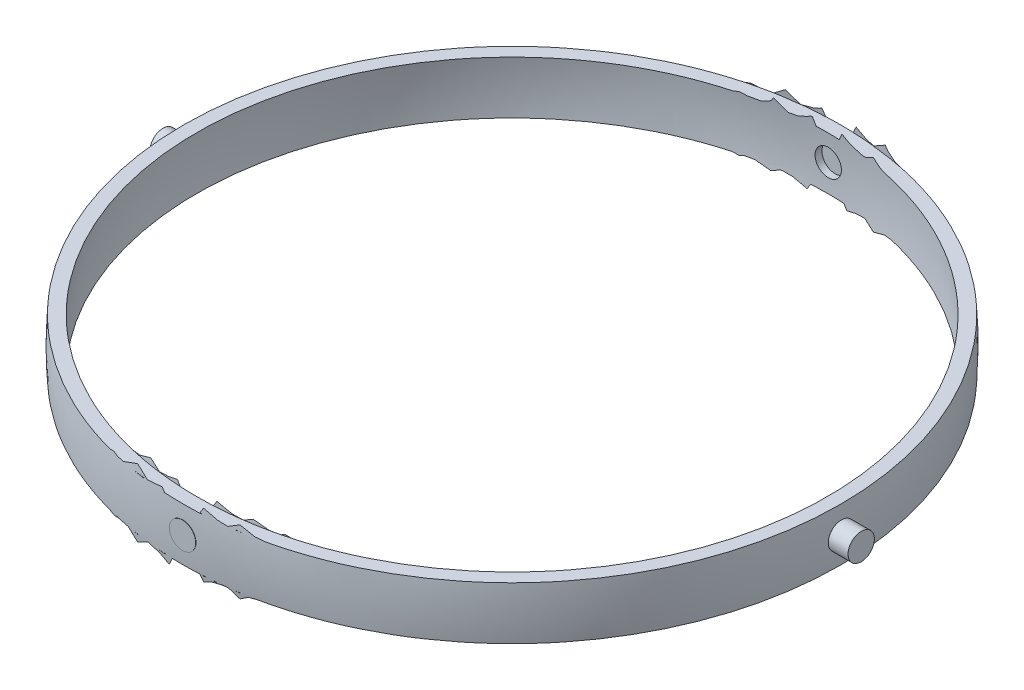
ISO-10303-21;
HEADER;
FILE_DESCRIPTION(('STEP AP214'),'2;1');
FILE_NAME('part.step','',(''),(''),'','','');
FILE_SCHEMA(('AUTOMOTIVE_DESIGN { 1 0 10303 214 1 1 1 1 }'));
ENDSEC;
DATA;
#1=APPLICATION_CONTEXT('core data for automotive mechanical design processes');
#2=APPLICATION_PROTOCOL_DEFINITION('international standard','automotive_design',2000,#1);
#3=PRODUCT_CONTEXT('',#1,'mechanical');
#4=PRODUCT('Part','Part','',(#3));
#5=PRODUCT_RELATED_PRODUCT_CATEGORY('part','',(#4));
#6=PRODUCT_DEFINITION_FORMATION('','',#4);
#7=PRODUCT_DEFINITION_CONTEXT('part definition',#1,'design');
#8=PRODUCT_DEFINITION('design','',#6,#7);
#9=PRODUCT_DEFINITION_SHAPE('','',#8);
#10=(LENGTH_UNIT() NAMED_UNIT(*) SI_UNIT(.MILLI.,.METRE.));
#11=(NAMED_UNIT(*) PLANE_ANGLE_UNIT() SI_UNIT($,.RADIAN.));
#12=(NAMED_UNIT(*) SI_UNIT($,.STERADIAN.) SOLID_ANGLE_UNIT());
#13=UNCERTAINTY_MEASURE_WITH_UNIT(LENGTH_MEASURE(1.E-05),#10,'distance_accuracy_value','');
#14=(GEOMETRIC_REPRESENTATION_CONTEXT(3) GLOBAL_UNCERTAINTY_ASSIGNED_CONTEXT((#13)) GLOBAL_UNIT_ASSIGNED_CONTEXT((#10,
#11,#12)) REPRESENTATION_CONTEXT('',''));
#15=CARTESIAN_POINT('',(0.,0.,0.));
#16=DIRECTION('',(0.,0.,1.));
#17=DIRECTION('',(1.,0.,0.));
#18=AXIS2_PLACEMENT_3D('',#15,#16,#17);
#19=CARTESIAN_POINT('',(-52.9600007301569,0.,0.));
#20=DIRECTION('',(1.,0.,0.));
#21=DIRECTION('',(0.,1.,0.));
#22=AXIS2_PLACEMENT_3D('',#19,#20,#21);
#23=PLANE('',#22);
#24=CARTESIAN_POINT('',(-52.9600007301569,0.,0.));
#25=DIRECTION('',(-1.,0.,0.));
#26=DIRECTION('',(0.,1.,0.));
#27=AXIS2_PLACEMENT_3D('',#24,#25,#26);
#28=CIRCLE('',#27,2.);
#29=CARTESIAN_POINT('',(-52.9600007301569,-2.,0.));
#30=VERTEX_POINT('',#29);
#31=EDGE_CURVE('E9',#30,#30,#28,.T.);
#32=ORIENTED_EDGE('',*,*,#31,.T.);
#33=EDGE_LOOP('',(#32));
#34=FACE_BOUND('',#33,.T.);
#35=ADVANCED_FACE('F14',(#34),#23,.F.);
#36=CARTESIAN_POINT('',(52.9600007301569,0.,0.));
#37=DIRECTION('',(1.,0.,0.));
#38=DIRECTION('',(0.,1.,0.));
#39=AXIS2_PLACEMENT_3D('',#36,#37,#38);
#40=PLANE('',#39);
#41=CARTESIAN_POINT('',(52.9600007301569,0.,0.));
#42=DIRECTION('',(1.,0.,0.));
#43=DIRECTION('',(0.,1.,0.));
#44=AXIS2_PLACEMENT_3D('',#41,#42,#43);
#45=CIRCLE('',#44,2.);
#46=CARTESIAN_POINT('',(52.9600007301569,-2.,0.));
#47=VERTEX_POINT('',#46);
#48=EDGE_CURVE('E25',#47,#47,#45,.T.);
#49=ORIENTED_EDGE('',*,*,#48,.T.);
#50=EDGE_LOOP('',(#49));
#51=FACE_BOUND('',#50,.T.);
#52=ADVANCED_FACE('F214',(#51),#40,.T.);
#53=CARTESIAN_POINT('',(0.,0.,-50.));
#54=DIRECTION('',(0.,0.,1.));
#55=DIRECTION('',(1.,0.,0.));
#56=AXIS2_PLACEMENT_3D('',#53,#54,#55);
#57=CYLINDRICAL_SURFACE('',#56,2.);
#58=CARTESIAN_POINT('',(0.,0.,-49.9599839871872));
#59=DIRECTION('',(0.,0.,1.));
#60=DIRECTION('',(1.,0.,0.));
#61=AXIS2_PLACEMENT_3D('',#58,#59,#60);
#62=CIRCLE('',#61,2.);
#63=CARTESIAN_POINT('',(-2.,0.,-49.9599839871872));
#64=VERTEX_POINT('',#63);
#65=EDGE_CURVE('E104',#64,#64,#62,.T.);
#66=ORIENTED_EDGE('',*,*,#65,.F.);
#67=DIRECTION('',(0.,0.,-1.));
#68=VECTOR('',#67,1.);
#69=CARTESIAN_POINT('',(-2.,0.,-50.));
#70=LINE('',#69,#68);
#71=CARTESIAN_POINT('',(-2.,0.,-50.));
#72=VERTEX_POINT('',#71);
#73=EDGE_CURVE('E173',#64,#72,#70,.T.);
#74=ORIENTED_EDGE('',*,*,#73,.T.);
#75=CARTESIAN_POINT('',(0.,0.,-50.));
#76=DIRECTION('',(0.,0.,1.));
#77=DIRECTION('',(1.,0.,0.));
#78=AXIS2_PLACEMENT_3D('',#75,#76,#77);
#79=CIRCLE('',#78,2.);
#80=EDGE_CURVE('E134',#72,#72,#79,.T.);
#81=ORIENTED_EDGE('',*,*,#80,.T.);
#82=ORIENTED_EDGE('',*,*,#73,.F.);
#83=EDGE_LOOP('',(#66,#74,#81,#82));
#84=FACE_BOUND('',#83,.T.);
#85=ADVANCED_FACE('F216',(#84),#57,.T.);
#86=CARTESIAN_POINT('',(0.,0.,-49.));
#87=DIRECTION('',(0.,0.,1.));
#88=DIRECTION('',(1.,0.,0.));
#89=AXIS2_PLACEMENT_3D('',#86,#87,#88);
#90=PLANE('',#89);
#91=CARTESIAN_POINT('',(0.,0.,-49.));
#92=DIRECTION('',(0.,0.,-1.));
#93=DIRECTION('',(1.,0.,0.));
#94=AXIS2_PLACEMENT_3D('',#91,#92,#93);
#95=CIRCLE('',#94,2.);
#96=CARTESIAN_POINT('',(-2.,0.,-49.));
#97=VERTEX_POINT('',#96);
#98=EDGE_CURVE('E182',#97,#97,#95,.T.);
#99=ORIENTED_EDGE('',*,*,#98,.F.);
#100=EDGE_LOOP('',(#99));
#101=FACE_BOUND('',#100,.T.);
#102=ADVANCED_FACE('F223',(#101),#90,.T.);
#103=CARTESIAN_POINT('',(0.,0.,-50.));
#104=DIRECTION('',(0.,0.,1.));
#105=DIRECTION('',(1.,0.,0.));
#106=AXIS2_PLACEMENT_3D('',#103,#104,#105);
#107=PLANE('',#106);
#108=ORIENTED_EDGE('',*,*,#80,.F.);
#109=EDGE_LOOP('',(#108));
#110=FACE_BOUND('',#109,.T.);
#111=ADVANCED_FACE('F252',(#110),#107,.F.);
#112=CARTESIAN_POINT('',(0.,0.,50.));
#113=DIRECTION('',(0.,0.,-1.));
#114=DIRECTION('',(1.,0.,0.));
#115=AXIS2_PLACEMENT_3D('',#112,#113,#114);
#116=CYLINDRICAL_SURFACE('',#115,2.);
#117=CARTESIAN_POINT('',(0.,0.,49.9599839871872));
#118=DIRECTION('',(0.,0.,-1.));
#119=DIRECTION('',(1.,0.,0.));
#120=AXIS2_PLACEMENT_3D('',#117,#118,#119);
#121=CIRCLE('',#120,2.);
#122=CARTESIAN_POINT('',(-2.,0.,49.9599839871872));
#123=VERTEX_POINT('',#122);
#124=EDGE_CURVE('E123',#123,#123,#121,.T.);
#125=ORIENTED_EDGE('',*,*,#124,.F.);
#126=DIRECTION('',(0.,0.,1.));
#127=VECTOR('',#126,1.);
#128=CARTESIAN_POINT('',(-2.,0.,50.));
#129=LINE('',#128,#127);
#130=CARTESIAN_POINT('',(-2.,0.,50.));
#131=VERTEX_POINT('',#130);
#132=EDGE_CURVE('E130',#123,#131,#129,.T.);
#133=ORIENTED_EDGE('',*,*,#132,.T.);
#134=CARTESIAN_POINT('',(0.,0.,50.));
#135=DIRECTION('',(0.,0.,1.));
#136=DIRECTION('',(1.,0.,0.));
#137=AXIS2_PLACEMENT_3D('',#134,#135,#136);
#138=CIRCLE('',#137,2.);
#139=EDGE_CURVE('E135',#131,#131,#138,.T.);
#140=ORIENTED_EDGE('',*,*,#139,.F.);
#141=ORIENTED_EDGE('',*,*,#132,.F.);
#142=EDGE_LOOP('',(#125,#133,#140,#141));
#143=FACE_BOUND('',#142,.T.);
#144=ADVANCED_FACE('F247',(#143),#116,.T.);
#145=CARTESIAN_POINT('',(0.,0.,50.));
#146=DIRECTION('',(0.,0.,1.));
#147=DIRECTION('',(1.,0.,0.));
#148=AXIS2_PLACEMENT_3D('',#145,#146,#147);
#149=PLANE('',#148);
#150=ORIENTED_EDGE('',*,*,#139,.T.);
#151=EDGE_LOOP('',(#150));
#152=FACE_BOUND('',#151,.T.);
#153=ADVANCED_FACE('F245',(#152),#149,.T.);
#154=CARTESIAN_POINT('',(0.,0.,49.));
#155=DIRECTION('',(0.,0.,1.));
#156=DIRECTION('',(1.,0.,0.));
#157=AXIS2_PLACEMENT_3D('',#154,#155,#156);
#158=PLANE('',#157);
#159=CARTESIAN_POINT('',(0.,0.,49.));
#160=DIRECTION('',(0.,0.,1.));
#161=DIRECTION('',(1.,0.,0.));
#162=AXIS2_PLACEMENT_3D('',#159,#160,#161);
#163=CIRCLE('',#162,2.);
#164=CARTESIAN_POINT('',(-2.,0.,49.));
#165=VERTEX_POINT('',#164);
#166=EDGE_CURVE('E141',#165,#165,#163,.T.);
#167=ORIENTED_EDGE('',*,*,#166,.F.);
#168=EDGE_LOOP('',(#167));
#169=FACE_BOUND('',#168,.T.);
#170=ADVANCED_FACE('F240',(#169),#158,.F.);
#171=CARTESIAN_POINT('',(-49.0000007301569,0.,0.));
#172=DIRECTION('',(1.,0.,0.));
#173=DIRECTION('',(0.,1.,0.));
#174=AXIS2_PLACEMENT_3D('',#171,#172,#173);
#175=CYLINDRICAL_SURFACE('',#174,2.);
#176=ORIENTED_EDGE('',*,*,#31,.F.);
#177=DIRECTION('',(1.,0.,0.));
#178=VECTOR('',#177,1.);
#179=CARTESIAN_POINT('',(-49.0000007301569,-2.,0.));
#180=LINE('',#179,#178);
#181=CARTESIAN_POINT('',(-49.9599839871872,-2.,0.));
#182=VERTEX_POINT('',#181);
#183=EDGE_CURVE('E159',#30,#182,#180,.T.);
#184=ORIENTED_EDGE('',*,*,#183,.T.);
#185=CARTESIAN_POINT('',(-49.9599839871872,0.,0.));
#186=DIRECTION('',(1.,0.,0.));
#187=DIRECTION('',(0.,1.,0.));
#188=AXIS2_PLACEMENT_3D('',#185,#186,#187);
#189=CIRCLE('',#188,2.);
#190=CARTESIAN_POINT('',(-49.9599839871872,0.,2.));
#191=VERTEX_POINT('',#190);
#192=EDGE_CURVE('E98',#191,#182,#189,.T.);
#193=ORIENTED_EDGE('',*,*,#192,.F.);
#194=CARTESIAN_POINT('',(-49.9599839871872,0.,0.));
#195=DIRECTION('',(1.,0.,0.));
#196=DIRECTION('',(0.,1.,0.));
#197=AXIS2_PLACEMENT_3D('',#194,#195,#196);
#198=CIRCLE('',#197,2.);
#199=CARTESIAN_POINT('',(-49.9599839871872,0.,-2.));
#200=VERTEX_POINT('',#199);
#201=EDGE_CURVE('E93',#200,#191,#198,.T.);
#202=ORIENTED_EDGE('',*,*,#201,.F.);
#203=CARTESIAN_POINT('',(-49.9599839871872,0.,0.));
#204=DIRECTION('',(1.,0.,0.));
#205=DIRECTION('',(0.,1.,0.));
#206=AXIS2_PLACEMENT_3D('',#203,#204,#205);
#207=CIRCLE('',#206,2.);
#208=EDGE_CURVE('E96',#182,#200,#207,.T.);
#209=ORIENTED_EDGE('',*,*,#208,.F.);
#210=ORIENTED_EDGE('',*,*,#183,.F.);
#211=EDGE_LOOP('',(#176,#184,#193,#202,#209,#210));
#212=FACE_BOUND('',#211,.T.);
#213=ADVANCED_FACE('F95',(#212),#175,.T.);
#214=CARTESIAN_POINT('',(0.,0.,0.));
#215=DIRECTION('',(0.,0.,1.));
#216=DIRECTION('',(1.,0.,0.));
#217=AXIS2_PLACEMENT_3D('',#214,#215,#216);
#218=SPHERICAL_SURFACE('',#217,48.);
#219=CARTESIAN_POINT('',(0.,0.,-47.9583152331272));
#220=DIRECTION('',(0.,0.,-1.));
#221=DIRECTION('',(1.,0.,0.));
#222=AXIS2_PLACEMENT_3D('',#219,#220,#221);
#223=CIRCLE('',#222,2.);
#224=CARTESIAN_POINT('',(-2.,0.,-47.9583152331272));
#225=VERTEX_POINT('',#224);
#226=EDGE_CURVE('E153',#225,#225,#223,.T.);
#227=ORIENTED_EDGE('',*,*,#226,.T.);
#228=CARTESIAN_POINT('',(0.,0.,0.));
#229=DIRECTION('',(0.,1.,0.));
#230=DIRECTION('',(-1.,0.,0.));
#231=AXIS2_PLACEMENT_3D('',#228,#229,#230);
#232=CIRCLE('',#231,48.);
#233=CARTESIAN_POINT('',(-2.,0.,47.9583152331272));
#234=VERTEX_POINT('',#233);
#235=EDGE_CURVE('E150',#225,#234,#232,.T.);
#236=ORIENTED_EDGE('',*,*,#235,.T.);
#237=CARTESIAN_POINT('',(0.,0.,47.9583152331272));
#238=DIRECTION('',(0.,0.,1.));
#239=DIRECTION('',(1.,0.,0.));
#240=AXIS2_PLACEMENT_3D('',#237,#238,#239);
#241=CIRCLE('',#240,2.);
#242=EDGE_CURVE('E154',#234,#234,#241,.T.);
#243=ORIENTED_EDGE('',*,*,#242,.T.);
#244=ORIENTED_EDGE('',*,*,#235,.F.);
#245=EDGE_LOOP('',(#227,#236,#243,#244));
#246=FACE_BOUND('',#245,.T.);
#247=CARTESIAN_POINT('',(0.,4.,0.));
#248=DIRECTION('',(0.,-1.,0.));
#249=DIRECTION('',(0.,0.,1.));
#250=AXIS2_PLACEMENT_3D('',#247,#248,#249);
#251=CIRCLE('',#250,47.8330429724056);
#252=CARTESIAN_POINT('',(0.,4.,-47.8330429724056));
#253=VERTEX_POINT('',#252);
#254=EDGE_CURVE('E126',#253,#253,#251,.T.);
#255=ORIENTED_EDGE('',*,*,#254,.F.);
#256=EDGE_LOOP('',(#255));
#257=FACE_BOUND('',#256,.T.);
#258=CARTESIAN_POINT('',(0.,-4.,0.));
#259=DIRECTION('',(0.,1.,0.));
#260=DIRECTION('',(0.,0.,-1.));
#261=AXIS2_PLACEMENT_3D('',#258,#259,#260);
#262=CIRCLE('',#261,47.8330429724056);
#263=CARTESIAN_POINT('',(0.,-4.,47.8330429724056));
#264=VERTEX_POINT('',#263);
#265=EDGE_CURVE('E146',#264,#264,#262,.T.);
#266=ORIENTED_EDGE('',*,*,#265,.F.);
#267=EDGE_LOOP('',(#266));
#268=FACE_BOUND('',#267,.T.);
#269=ADVANCED_FACE('F235',(#246,#257,#268),#218,.F.);
#270=CARTESIAN_POINT('',(49.0000007301569,0.,0.));
#271=DIRECTION('',(1.,0.,0.));
#272=DIRECTION('',(0.,1.,0.));
#273=AXIS2_PLACEMENT_3D('',#270,#271,#272);
#274=CYLINDRICAL_SURFACE('',#273,2.);
#275=ORIENTED_EDGE('',*,*,#48,.F.);
#276=DIRECTION('',(-1.,0.,0.));
#277=VECTOR('',#276,1.);
#278=CARTESIAN_POINT('',(49.0000007301569,-2.,0.));
#279=LINE('',#278,#277);
#280=CARTESIAN_POINT('',(49.9599839871872,-2.,0.));
#281=VERTEX_POINT('',#280);
#282=EDGE_CURVE('E165',#47,#281,#279,.T.);
#283=ORIENTED_EDGE('',*,*,#282,.T.);
#284=CARTESIAN_POINT('',(49.9599839871872,0.,0.));
#285=DIRECTION('',(-1.,0.,0.));
#286=DIRECTION('',(0.,1.,0.));
#287=AXIS2_PLACEMENT_3D('',#284,#285,#286);
#288=CIRCLE('',#287,2.);
#289=EDGE_CURVE('E105',#281,#281,#288,.T.);
#290=ORIENTED_EDGE('',*,*,#289,.F.);
#291=ORIENTED_EDGE('',*,*,#282,.F.);
#292=EDGE_LOOP('',(#275,#283,#290,#291));
#293=FACE_BOUND('',#292,.T.);
#294=ADVANCED_FACE('F212',(#293),#274,.T.);
#295=CARTESIAN_POINT('',(0.,0.,0.));
#296=DIRECTION('',(0.,0.,1.));
#297=DIRECTION('',(1.,0.,0.));
#298=AXIS2_PLACEMENT_3D('',#295,#296,#297);
#299=CYLINDRICAL_SURFACE('',#298,2.);
#300=ORIENTED_EDGE('',*,*,#98,.T.);
#301=DIRECTION('',(0.,0.,1.));
#302=VECTOR('',#301,1.);
#303=CARTESIAN_POINT('',(-2.,0.,0.));
#304=LINE('',#303,#302);
#305=EDGE_CURVE('E169',#97,#225,#304,.T.);
#306=ORIENTED_EDGE('',*,*,#305,.T.);
#307=ORIENTED_EDGE('',*,*,#226,.F.);
#308=ORIENTED_EDGE('',*,*,#305,.F.);
#309=EDGE_LOOP('',(#300,#306,#307,#308));
#310=FACE_BOUND('',#309,.T.);
#311=ADVANCED_FACE('F234',(#310),#299,.F.);
#312=CARTESIAN_POINT('',(0.,0.,0.));
#313=DIRECTION('',(0.,0.,1.));
#314=DIRECTION('',(1.,0.,0.));
#315=AXIS2_PLACEMENT_3D('',#312,#313,#314);
#316=CYLINDRICAL_SURFACE('',#315,2.);
#317=ORIENTED_EDGE('',*,*,#242,.F.);
#318=DIRECTION('',(0.,0.,1.));
#319=VECTOR('',#318,1.);
#320=CARTESIAN_POINT('',(-2.,0.,0.));
#321=LINE('',#320,#319);
#322=EDGE_CURVE('E145',#234,#165,#321,.T.);
#323=ORIENTED_EDGE('',*,*,#322,.T.);
#324=ORIENTED_EDGE('',*,*,#166,.T.);
#325=ORIENTED_EDGE('',*,*,#322,.F.);
#326=EDGE_LOOP('',(#317,#323,#324,#325));
#327=FACE_BOUND('',#326,.T.);
#328=ADVANCED_FACE('F16',(#327),#316,.F.);
#329=CARTESIAN_POINT('',(70.,-4.,0.));
#330=DIRECTION('',(0.,1.,0.));
#331=DIRECTION('',(1.,0.,0.));
#332=AXIS2_PLACEMENT_3D('',#329,#330,#331);
#333=PLANE('',#332);
#334=CARTESIAN_POINT('',(0.,-4.,0.));
#335=DIRECTION('',(0.,1.,0.));
#336=DIRECTION('',(0.,0.,-1.));
#337=AXIS2_PLACEMENT_3D('',#334,#335,#336);
#338=CIRCLE('',#337,49.8397431775085);
#339=CARTESIAN_POINT('',(0.,-4.,49.8397431775085));
#340=VERTEX_POINT('',#339);
#341=EDGE_CURVE('E140',#340,#340,#338,.T.);
#342=ORIENTED_EDGE('',*,*,#341,.F.);
#343=EDGE_LOOP('',(#342));
#344=FACE_BOUND('',#343,.T.);
#345=ORIENTED_EDGE('',*,*,#265,.T.);
#346=EDGE_LOOP('',(#345));
#347=FACE_BOUND('',#346,.T.);
#348=ADVANCED_FACE('F230',(#344,#347),#333,.F.);
#349=CARTESIAN_POINT('',(-70.,4.,0.));
#350=DIRECTION('',(0.,-1.,0.));
#351=DIRECTION('',(0.,0.,-1.));
#352=AXIS2_PLACEMENT_3D('',#349,#350,#351);
#353=PLANE('',#352);
#354=CARTESIAN_POINT('',(0.,4.,0.));
#355=DIRECTION('',(0.,-1.,0.));
#356=DIRECTION('',(0.,0.,1.));
#357=AXIS2_PLACEMENT_3D('',#354,#355,#356);
#358=CIRCLE('',#357,49.8397431775085);
#359=CARTESIAN_POINT('',(0.,4.,-49.8397431775085));
#360=VERTEX_POINT('',#359);
#361=EDGE_CURVE('E136',#360,#360,#358,.T.);
#362=ORIENTED_EDGE('',*,*,#361,.F.);
#363=EDGE_LOOP('',(#362));
#364=FACE_BOUND('',#363,.T.);
#365=ORIENTED_EDGE('',*,*,#254,.T.);
#366=EDGE_LOOP('',(#365));
#367=FACE_BOUND('',#366,.T.);
#368=ADVANCED_FACE('F241',(#364,#367),#353,.F.);
#369=CARTESIAN_POINT('',(0.,0.,0.));
#370=DIRECTION('',(0.,0.,1.));
#371=DIRECTION('',(1.,0.,0.));
#372=AXIS2_PLACEMENT_3D('',#369,#370,#371);
#373=SPHERICAL_SURFACE('',#372,50.);
#374=ORIENTED_EDGE('',*,*,#124,.T.);
#375=CARTESIAN_POINT('',(0.,0.,0.));
#376=DIRECTION('',(0.,-1.,0.));
#377=DIRECTION('',(-1.,0.,0.));
#378=AXIS2_PLACEMENT_3D('',#375,#376,#377);
#379=CIRCLE('',#378,50.);
#380=EDGE_CURVE('E127',#123,#191,#379,.T.);
#381=ORIENTED_EDGE('',*,*,#380,.T.);
#382=ORIENTED_EDGE('',*,*,#192,.T.);
#383=ORIENTED_EDGE('',*,*,#208,.T.);
#384=CARTESIAN_POINT('',(0.,0.,0.));
#385=DIRECTION('',(0.,-1.,0.));
#386=DIRECTION('',(-1.,0.,0.));
#387=AXIS2_PLACEMENT_3D('',#384,#385,#386);
#388=CIRCLE('',#387,50.);
#389=EDGE_CURVE('E18',#200,#64,#388,.T.);
#390=ORIENTED_EDGE('',*,*,#389,.T.);
#391=ORIENTED_EDGE('',*,*,#65,.T.);
#392=ORIENTED_EDGE('',*,*,#389,.F.);
#393=ORIENTED_EDGE('',*,*,#201,.T.);
#394=ORIENTED_EDGE('',*,*,#380,.F.);
#395=EDGE_LOOP('',(#374,#381,#382,#383,#390,#391,#392,#393,#394));
#396=FACE_BOUND('',#395,.T.);
#397=ORIENTED_EDGE('',*,*,#289,.T.);
#398=EDGE_LOOP('',(#397));
#399=FACE_BOUND('',#398,.T.);
#400=ORIENTED_EDGE('',*,*,#341,.T.);
#401=EDGE_LOOP('',(#400));
#402=FACE_BOUND('',#401,.T.);
#403=ORIENTED_EDGE('',*,*,#361,.T.);
#404=EDGE_LOOP('',(#403));
#405=FACE_BOUND('',#404,.T.);
#406=ADVANCED_FACE('F109',(#396,#399,#402,#405),#373,.T.);
#407=CLOSED_SHELL('',(#35,#52,#85,#102,#111,#144,#153,#170,#213,#269,#294,#311,#328,#348,#368,#406));
#408=MANIFOLD_SOLID_BREP('B1',#407);
#409=ADVANCED_BREP_SHAPE_REPRESENTATION('',(#18,#408),#14);
#410=SHAPE_DEFINITION_REPRESENTATION(#9,#409);
ENDSEC;
END-ISO-10303-21;
